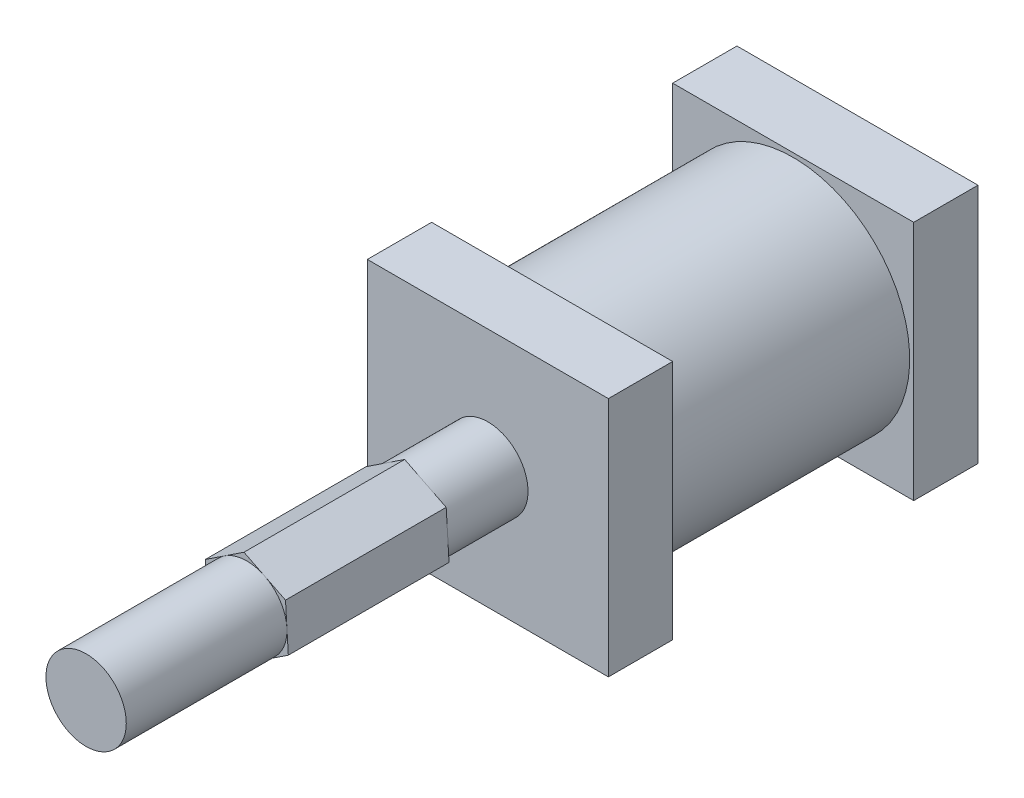
ISO-10303-21;
HEADER;
FILE_DESCRIPTION(('STEP AP214'),'2;1');
FILE_NAME('part.step','',(''),(''),'','','');
FILE_SCHEMA(('AUTOMOTIVE_DESIGN { 1 0 10303 214 1 1 1 1 }'));
ENDSEC;
DATA;
#1=APPLICATION_CONTEXT('core data for automotive mechanical design processes');
#2=APPLICATION_PROTOCOL_DEFINITION('international standard','automotive_design',2000,#1);
#3=PRODUCT_CONTEXT('',#1,'mechanical');
#4=PRODUCT('Part','Part','',(#3));
#5=PRODUCT_RELATED_PRODUCT_CATEGORY('part','',(#4));
#6=PRODUCT_DEFINITION_FORMATION('','',#4);
#7=PRODUCT_DEFINITION_CONTEXT('part definition',#1,'design');
#8=PRODUCT_DEFINITION('design','',#6,#7);
#9=PRODUCT_DEFINITION_SHAPE('','',#8);
#10=(LENGTH_UNIT() NAMED_UNIT(*) SI_UNIT(.MILLI.,.METRE.));
#11=(NAMED_UNIT(*) PLANE_ANGLE_UNIT() SI_UNIT($,.RADIAN.));
#12=(NAMED_UNIT(*) SI_UNIT($,.STERADIAN.) SOLID_ANGLE_UNIT());
#13=UNCERTAINTY_MEASURE_WITH_UNIT(LENGTH_MEASURE(1.E-05),#10,'distance_accuracy_value','');
#14=(GEOMETRIC_REPRESENTATION_CONTEXT(3) GLOBAL_UNCERTAINTY_ASSIGNED_CONTEXT((#13)) GLOBAL_UNIT_ASSIGNED_CONTEXT((#10,
#11,#12)) REPRESENTATION_CONTEXT('',''));
#15=CARTESIAN_POINT('',(0.,0.,0.));
#16=DIRECTION('',(0.,0.,1.));
#17=DIRECTION('',(1.,0.,0.));
#18=AXIS2_PLACEMENT_3D('',#15,#16,#17);
#19=CARTESIAN_POINT('',(0.,0.,96.52));
#20=DIRECTION('',(0.,0.,1.));
#21=DIRECTION('',(1.,0.,0.));
#22=AXIS2_PLACEMENT_3D('',#19,#20,#21);
#23=PLANE('',#22);
#24=CARTESIAN_POINT('',(19.05,19.05,96.52));
#25=DIRECTION('',(0.,0.,1.));
#26=DIRECTION('',(1.,0.,0.));
#27=AXIS2_PLACEMENT_3D('',#24,#25,#26);
#28=CIRCLE('',#27,6.35);
#29=CARTESIAN_POINT('',(25.3881327042533,19.4380384301526,96.52));
#30=VERTEX_POINT('',#29);
#31=CARTESIAN_POINT('',(21.8830152139698,24.7330031495166,96.52));
#32=VERTEX_POINT('',#31);
#33=EDGE_CURVE('E44',#30,#32,#28,.T.);
#34=ORIENTED_EDGE('',*,*,#33,.F.);
#35=DIRECTION('',(-0.0611084141972613,0.998131134528072,0.));
#36=VECTOR('',#35,1.);
#37=CARTESIAN_POINT('',(25.6121667963578,15.7787158071924,96.52));
#38=LINE('',#37,#36);
#39=CARTESIAN_POINT('',(25.1640986121487,23.0973610531128,96.52));
#40=VERTEX_POINT('',#39);
#41=EDGE_CURVE('E180',#30,#40,#38,.T.);
#42=ORIENTED_EDGE('',*,*,#41,.T.);
#43=DIRECTION('',(-0.894961125908124,0.446144128184226,0.));
#44=VECTOR('',#43,1.);
#45=CARTESIAN_POINT('',(25.1640986121487,23.0973610531128,96.52));
#46=LINE('',#45,#44);
#47=EDGE_CURVE('E193',#40,#32,#46,.T.);
#48=ORIENTED_EDGE('',*,*,#47,.T.);
#49=EDGE_LOOP('',(#34,#42,#48));
#50=FACE_BOUND('',#49,.T.);
#51=ADVANCED_FACE('F33',(#50),#23,.T.);
#52=CARTESIAN_POINT('',(15.5448825097166,24.344964719364,96.52));
#53=VERTEX_POINT('',#52);
#54=EDGE_CURVE('E11',#32,#53,#28,.T.);
#55=ORIENTED_EDGE('',*,*,#54,.F.);
#56=CARTESIAN_POINT('',(18.601931815791,26.3686452459204,96.52));
#57=VERTEX_POINT('',#56);
#58=EDGE_CURVE('E179',#32,#57,#46,.T.);
#59=ORIENTED_EDGE('',*,*,#58,.T.);
#60=DIRECTION('',(-0.833852711710863,-0.551987006343845,0.));
#61=VECTOR('',#60,1.);
#62=CARTESIAN_POINT('',(18.601931815791,26.3686452459204,96.52));
#63=LINE('',#62,#61);
#64=EDGE_CURVE('E205',#57,#53,#63,.T.);
#65=ORIENTED_EDGE('',*,*,#64,.T.);
#66=EDGE_LOOP('',(#55,#59,#65));
#67=FACE_BOUND('',#66,.T.);
#68=ADVANCED_FACE('F344',(#67),#23,.T.);
#69=CARTESIAN_POINT('',(12.7118672957468,18.6619615698474,96.52));
#70=VERTEX_POINT('',#69);
#71=EDGE_CURVE('E42',#53,#70,#28,.T.);
#72=ORIENTED_EDGE('',*,*,#71,.F.);
#73=CARTESIAN_POINT('',(12.4878332036422,22.3212841928076,96.52));
#74=VERTEX_POINT('',#73);
#75=EDGE_CURVE('E204',#53,#74,#63,.T.);
#76=ORIENTED_EDGE('',*,*,#75,.T.);
#77=DIRECTION('',(0.0611084141972611,-0.998131134528072,0.));
#78=VECTOR('',#77,1.);
#79=CARTESIAN_POINT('',(12.4878332036422,22.3212841928076,96.52));
#80=LINE('',#79,#78);
#81=EDGE_CURVE('E209',#74,#70,#80,.T.);
#82=ORIENTED_EDGE('',*,*,#81,.T.);
#83=EDGE_LOOP('',(#72,#76,#82));
#84=FACE_BOUND('',#83,.T.);
#85=ADVANCED_FACE('F349',(#84),#23,.T.);
#86=CARTESIAN_POINT('',(16.2169847860302,13.3669968504834,96.52));
#87=VERTEX_POINT('',#86);
#88=EDGE_CURVE('E198',#70,#87,#28,.T.);
#89=ORIENTED_EDGE('',*,*,#88,.F.);
#90=CARTESIAN_POINT('',(12.9359013878513,15.0026389468872,96.52));
#91=VERTEX_POINT('',#90);
#92=EDGE_CURVE('E208',#70,#91,#80,.T.);
#93=ORIENTED_EDGE('',*,*,#92,.T.);
#94=DIRECTION('',(0.894961125908124,-0.446144128184226,0.));
#95=VECTOR('',#94,1.);
#96=CARTESIAN_POINT('',(12.9359013878513,15.0026389468872,96.52));
#97=LINE('',#96,#95);
#98=EDGE_CURVE('E213',#91,#87,#97,.T.);
#99=ORIENTED_EDGE('',*,*,#98,.T.);
#100=EDGE_LOOP('',(#89,#93,#99));
#101=FACE_BOUND('',#100,.T.);
#102=ADVANCED_FACE('F365',(#101),#23,.T.);
#103=CARTESIAN_POINT('',(22.5551174902834,13.755035280636,96.52));
#104=VERTEX_POINT('',#103);
#105=EDGE_CURVE('E59',#87,#104,#28,.T.);
#106=ORIENTED_EDGE('',*,*,#105,.F.);
#107=CARTESIAN_POINT('',(19.4980681842091,11.7313547540796,96.52));
#108=VERTEX_POINT('',#107);
#109=EDGE_CURVE('E212',#87,#108,#97,.T.);
#110=ORIENTED_EDGE('',*,*,#109,.T.);
#111=DIRECTION('',(0.833852711710863,0.551987006343845,0.));
#112=VECTOR('',#111,1.);
#113=CARTESIAN_POINT('',(19.4980681842091,11.7313547540796,96.52));
#114=LINE('',#113,#112);
#115=EDGE_CURVE('E216',#108,#104,#114,.T.);
#116=ORIENTED_EDGE('',*,*,#115,.T.);
#117=EDGE_LOOP('',(#106,#110,#116));
#118=FACE_BOUND('',#117,.T.);
#119=ADVANCED_FACE('F338',(#118),#23,.T.);
#120=CARTESIAN_POINT('',(0.,0.,58.42));
#121=DIRECTION('',(0.,0.,-1.));
#122=DIRECTION('',(-1.,0.,0.));
#123=AXIS2_PLACEMENT_3D('',#120,#121,#122);
#124=PLANE('',#123);
#125=DIRECTION('',(0.,-1.,0.));
#126=VECTOR('',#125,1.);
#127=CARTESIAN_POINT('',(0.,0.,58.42));
#128=LINE('',#127,#126);
#129=CARTESIAN_POINT('',(0.,38.1,58.42));
#130=VERTEX_POINT('',#129);
#131=CARTESIAN_POINT('',(0.,0.,58.42));
#132=VERTEX_POINT('',#131);
#133=EDGE_CURVE('E261',#130,#132,#128,.T.);
#134=ORIENTED_EDGE('',*,*,#133,.T.);
#135=DIRECTION('',(1.,0.,0.));
#136=VECTOR('',#135,1.);
#137=CARTESIAN_POINT('',(0.,0.,58.42));
#138=LINE('',#137,#136);
#139=CARTESIAN_POINT('',(38.1,0.,58.42));
#140=VERTEX_POINT('',#139);
#141=EDGE_CURVE('E264',#132,#140,#138,.T.);
#142=ORIENTED_EDGE('',*,*,#141,.T.);
#143=DIRECTION('',(0.,1.,0.));
#144=VECTOR('',#143,1.);
#145=CARTESIAN_POINT('',(38.1,0.,58.42));
#146=LINE('',#145,#144);
#147=CARTESIAN_POINT('',(38.1,38.1,58.42));
#148=VERTEX_POINT('',#147);
#149=EDGE_CURVE('E267',#140,#148,#146,.T.);
#150=ORIENTED_EDGE('',*,*,#149,.T.);
#151=DIRECTION('',(-1.,0.,0.));
#152=VECTOR('',#151,1.);
#153=CARTESIAN_POINT('',(0.,38.1,58.42));
#154=LINE('',#153,#152);
#155=EDGE_CURVE('E269',#148,#130,#154,.T.);
#156=ORIENTED_EDGE('',*,*,#155,.T.);
#157=EDGE_LOOP('',(#134,#142,#150,#156));
#158=FACE_BOUND('',#157,.T.);
#159=CARTESIAN_POINT('',(19.05,19.05,58.42));
#160=DIRECTION('',(0.,0.,-1.));
#161=DIRECTION('',(-1.,0.,0.));
#162=AXIS2_PLACEMENT_3D('',#159,#160,#161);
#163=CIRCLE('',#162,6.35);
#164=CARTESIAN_POINT('',(12.7,19.05,58.42));
#165=VERTEX_POINT('',#164);
#166=EDGE_CURVE('E37',#165,#165,#163,.F.);
#167=ORIENTED_EDGE('',*,*,#166,.F.);
#168=EDGE_LOOP('',(#167));
#169=FACE_BOUND('',#168,.T.);
#170=ADVANCED_FACE('F329',(#158,#169),#124,.F.);
#171=CARTESIAN_POINT('',(0.,0.,10.16));
#172=DIRECTION('',(0.,0.,-1.));
#173=DIRECTION('',(-1.,0.,0.));
#174=AXIS2_PLACEMENT_3D('',#171,#172,#173);
#175=PLANE('',#174);
#176=DIRECTION('',(0.,-1.,0.));
#177=VECTOR('',#176,1.);
#178=CARTESIAN_POINT('',(0.,0.,10.16));
#179=LINE('',#178,#177);
#180=CARTESIAN_POINT('',(0.,38.1,10.16));
#181=VERTEX_POINT('',#180);
#182=CARTESIAN_POINT('',(0.,0.,10.16));
#183=VERTEX_POINT('',#182);
#184=EDGE_CURVE('E294',#181,#183,#179,.T.);
#185=ORIENTED_EDGE('',*,*,#184,.T.);
#186=DIRECTION('',(1.,0.,0.));
#187=VECTOR('',#186,1.);
#188=CARTESIAN_POINT('',(0.,0.,10.16));
#189=LINE('',#188,#187);
#190=CARTESIAN_POINT('',(38.1,0.,10.16));
#191=VERTEX_POINT('',#190);
#192=EDGE_CURVE('E297',#183,#191,#189,.T.);
#193=ORIENTED_EDGE('',*,*,#192,.T.);
#194=DIRECTION('',(0.,1.,0.));
#195=VECTOR('',#194,1.);
#196=CARTESIAN_POINT('',(38.1,0.,10.16));
#197=LINE('',#196,#195);
#198=CARTESIAN_POINT('',(38.1,38.1,10.16));
#199=VERTEX_POINT('',#198);
#200=EDGE_CURVE('E300',#191,#199,#197,.T.);
#201=ORIENTED_EDGE('',*,*,#200,.T.);
#202=DIRECTION('',(-1.,0.,0.));
#203=VECTOR('',#202,1.);
#204=CARTESIAN_POINT('',(0.,38.1,10.16));
#205=LINE('',#204,#203);
#206=EDGE_CURVE('E302',#199,#181,#205,.T.);
#207=ORIENTED_EDGE('',*,*,#206,.T.);
#208=EDGE_LOOP('',(#185,#193,#201,#207));
#209=FACE_BOUND('',#208,.T.);
#210=CARTESIAN_POINT('',(19.05,19.05,10.16));
#211=DIRECTION('',(0.,0.,-1.));
#212=DIRECTION('',(-1.,0.,0.));
#213=AXIS2_PLACEMENT_3D('',#210,#211,#212);
#214=CIRCLE('',#213,18.415);
#215=CARTESIAN_POINT('',(0.635000000000007,19.05,10.16));
#216=VERTEX_POINT('',#215);
#217=EDGE_CURVE('E200',#216,#216,#214,.F.);
#218=ORIENTED_EDGE('',*,*,#217,.F.);
#219=EDGE_LOOP('',(#218));
#220=FACE_BOUND('',#219,.T.);
#221=ADVANCED_FACE('F327',(#209,#220),#175,.F.);
#222=CARTESIAN_POINT('',(0.,0.,10.16));
#223=DIRECTION('',(1.,0.,0.));
#224=DIRECTION('',(0.,0.,-1.));
#225=AXIS2_PLACEMENT_3D('',#222,#223,#224);
#226=PLANE('',#225);
#227=DIRECTION('',(0.,-1.,0.));
#228=VECTOR('',#227,1.);
#229=CARTESIAN_POINT('',(0.,0.,0.));
#230=LINE('',#229,#228);
#231=CARTESIAN_POINT('',(0.,38.1,0.));
#232=VERTEX_POINT('',#231);
#233=CARTESIAN_POINT('',(0.,0.,0.));
#234=VERTEX_POINT('',#233);
#235=EDGE_CURVE('E293',#232,#234,#230,.T.);
#236=ORIENTED_EDGE('',*,*,#235,.T.);
#237=DIRECTION('',(0.,0.,-1.));
#238=VECTOR('',#237,1.);
#239=CARTESIAN_POINT('',(0.,0.,10.16));
#240=LINE('',#239,#238);
#241=EDGE_CURVE('E320',#183,#234,#240,.T.);
#242=ORIENTED_EDGE('',*,*,#241,.F.);
#243=ORIENTED_EDGE('',*,*,#184,.F.);
#244=DIRECTION('',(0.,0.,-1.));
#245=VECTOR('',#244,1.);
#246=CARTESIAN_POINT('',(0.,38.1,10.16));
#247=LINE('',#246,#245);
#248=EDGE_CURVE('E304',#181,#232,#247,.T.);
#249=ORIENTED_EDGE('',*,*,#248,.T.);
#250=EDGE_LOOP('',(#236,#242,#243,#249));
#251=FACE_BOUND('',#250,.T.);
#252=ADVANCED_FACE('F35',(#251),#226,.F.);
#253=CARTESIAN_POINT('',(0.,0.,10.16));
#254=DIRECTION('',(0.,1.,0.));
#255=DIRECTION('',(0.,0.,1.));
#256=AXIS2_PLACEMENT_3D('',#253,#254,#255);
#257=PLANE('',#256);
#258=DIRECTION('',(1.,0.,0.));
#259=VECTOR('',#258,1.);
#260=CARTESIAN_POINT('',(0.,0.,0.));
#261=LINE('',#260,#259);
#262=CARTESIAN_POINT('',(38.1,0.,0.));
#263=VERTEX_POINT('',#262);
#264=EDGE_CURVE('E307',#234,#263,#261,.T.);
#265=ORIENTED_EDGE('',*,*,#264,.T.);
#266=DIRECTION('',(0.,0.,-1.));
#267=VECTOR('',#266,1.);
#268=CARTESIAN_POINT('',(38.1,0.,10.16));
#269=LINE('',#268,#267);
#270=EDGE_CURVE('E317',#191,#263,#269,.T.);
#271=ORIENTED_EDGE('',*,*,#270,.F.);
#272=ORIENTED_EDGE('',*,*,#192,.F.);
#273=ORIENTED_EDGE('',*,*,#241,.T.);
#274=EDGE_LOOP('',(#265,#271,#272,#273));
#275=FACE_BOUND('',#274,.T.);
#276=ADVANCED_FACE('F336',(#275),#257,.F.);
#277=CARTESIAN_POINT('',(38.1,0.,10.16));
#278=DIRECTION('',(-1.,0.,0.));
#279=DIRECTION('',(0.,0.,1.));
#280=AXIS2_PLACEMENT_3D('',#277,#278,#279);
#281=PLANE('',#280);
#282=DIRECTION('',(0.,1.,0.));
#283=VECTOR('',#282,1.);
#284=CARTESIAN_POINT('',(38.1,0.,0.));
#285=LINE('',#284,#283);
#286=CARTESIAN_POINT('',(38.1,38.1,0.));
#287=VERTEX_POINT('',#286);
#288=EDGE_CURVE('E309',#263,#287,#285,.T.);
#289=ORIENTED_EDGE('',*,*,#288,.T.);
#290=DIRECTION('',(0.,0.,-1.));
#291=VECTOR('',#290,1.);
#292=CARTESIAN_POINT('',(38.1,38.1,10.16));
#293=LINE('',#292,#291);
#294=EDGE_CURVE('E314',#199,#287,#293,.T.);
#295=ORIENTED_EDGE('',*,*,#294,.F.);
#296=ORIENTED_EDGE('',*,*,#200,.F.);
#297=ORIENTED_EDGE('',*,*,#270,.T.);
#298=EDGE_LOOP('',(#289,#295,#296,#297));
#299=FACE_BOUND('',#298,.T.);
#300=ADVANCED_FACE('F649',(#299),#281,.F.);
#301=CARTESIAN_POINT('',(0.,38.1,10.16));
#302=DIRECTION('',(0.,-1.,0.));
#303=DIRECTION('',(0.,0.,-1.));
#304=AXIS2_PLACEMENT_3D('',#301,#302,#303);
#305=PLANE('',#304);
#306=DIRECTION('',(-1.,0.,0.));
#307=VECTOR('',#306,1.);
#308=CARTESIAN_POINT('',(0.,38.1,0.));
#309=LINE('',#308,#307);
#310=EDGE_CURVE('E298',#287,#232,#309,.T.);
#311=ORIENTED_EDGE('',*,*,#310,.T.);
#312=ORIENTED_EDGE('',*,*,#248,.F.);
#313=ORIENTED_EDGE('',*,*,#206,.F.);
#314=ORIENTED_EDGE('',*,*,#294,.T.);
#315=EDGE_LOOP('',(#311,#312,#313,#314));
#316=FACE_BOUND('',#315,.T.);
#317=ADVANCED_FACE('F640',(#316),#305,.F.);
#318=CARTESIAN_POINT('',(0.,0.,0.));
#319=DIRECTION('',(0.,0.,-1.));
#320=DIRECTION('',(-1.,0.,0.));
#321=AXIS2_PLACEMENT_3D('',#318,#319,#320);
#322=PLANE('',#321);
#323=ORIENTED_EDGE('',*,*,#235,.F.);
#324=ORIENTED_EDGE('',*,*,#310,.F.);
#325=ORIENTED_EDGE('',*,*,#288,.F.);
#326=ORIENTED_EDGE('',*,*,#264,.F.);
#327=EDGE_LOOP('',(#323,#324,#325,#326));
#328=FACE_BOUND('',#327,.T.);
#329=ADVANCED_FACE('F626',(#328),#322,.T.);
#330=CARTESIAN_POINT('',(19.05,19.05,48.26));
#331=DIRECTION('',(0.,0.,-1.));
#332=DIRECTION('',(-1.,0.,0.));
#333=AXIS2_PLACEMENT_3D('',#330,#331,#332);
#334=CYLINDRICAL_SURFACE('',#333,18.415);
#335=CARTESIAN_POINT('',(19.05,19.05,48.26));
#336=DIRECTION('',(0.,0.,1.));
#337=DIRECTION('',(1.,0.,0.));
#338=AXIS2_PLACEMENT_3D('',#335,#336,#337);
#339=CIRCLE('',#338,18.415);
#340=CARTESIAN_POINT('',(0.635000000000007,19.05,48.26));
#341=VERTEX_POINT('',#340);
#342=EDGE_CURVE('E290',#341,#341,#339,.T.);
#343=CARTESIAN_POINT('',(0.635000000000007,19.05,48.26));
#344=CARTESIAN_POINT('',(0.635000000000007,19.05,47.863125));
#345=CARTESIAN_POINT('',(0.635000000000007,19.05,47.46625));
#346=CARTESIAN_POINT('',(0.635000000000007,19.05,46.6725));
#347=CARTESIAN_POINT('',(0.635000000000007,19.05,46.275625));
#348=CARTESIAN_POINT('',(0.635000000000007,19.05,45.481875));
#349=CARTESIAN_POINT('',(0.635000000000007,19.05,45.085));
#350=CARTESIAN_POINT('',(0.635000000000007,19.05,44.29125));
#351=CARTESIAN_POINT('',(0.635000000000007,19.05,43.894375));
#352=CARTESIAN_POINT('',(0.635000000000007,19.05,43.100625));
#353=CARTESIAN_POINT('',(0.635000000000007,19.05,42.70375));
#354=CARTESIAN_POINT('',(0.635000000000007,19.05,41.91));
#355=CARTESIAN_POINT('',(0.635000000000007,19.05,41.513125));
#356=CARTESIAN_POINT('',(0.635000000000007,19.05,40.719375));
#357=CARTESIAN_POINT('',(0.635000000000007,19.05,40.3225));
#358=CARTESIAN_POINT('',(0.635000000000007,19.05,39.52875));
#359=CARTESIAN_POINT('',(0.635000000000007,19.05,39.131875));
#360=CARTESIAN_POINT('',(0.635000000000007,19.05,38.338125));
#361=CARTESIAN_POINT('',(0.635000000000007,19.05,37.94125));
#362=CARTESIAN_POINT('',(0.635000000000007,19.05,37.1475));
#363=CARTESIAN_POINT('',(0.635000000000007,19.05,36.750625));
#364=CARTESIAN_POINT('',(0.635000000000007,19.05,35.956875));
#365=CARTESIAN_POINT('',(0.635000000000007,19.05,35.56));
#366=CARTESIAN_POINT('',(0.635000000000007,19.05,34.76625));
#367=CARTESIAN_POINT('',(0.635000000000007,19.05,34.369375));
#368=CARTESIAN_POINT('',(0.635000000000007,19.05,33.575625));
#369=CARTESIAN_POINT('',(0.635000000000007,19.05,33.17875));
#370=CARTESIAN_POINT('',(0.635000000000007,19.05,32.385));
#371=CARTESIAN_POINT('',(0.635000000000007,19.05,31.988125));
#372=CARTESIAN_POINT('',(0.635000000000007,19.05,31.194375));
#373=CARTESIAN_POINT('',(0.635000000000007,19.05,30.7975));
#374=CARTESIAN_POINT('',(0.635000000000007,19.05,30.00375));
#375=CARTESIAN_POINT('',(0.635000000000007,19.05,29.606875));
#376=CARTESIAN_POINT('',(0.635000000000007,19.05,28.813125));
#377=CARTESIAN_POINT('',(0.635000000000007,19.05,28.41625));
#378=CARTESIAN_POINT('',(0.635000000000007,19.05,27.6225));
#379=CARTESIAN_POINT('',(0.635000000000007,19.05,27.225625));
#380=CARTESIAN_POINT('',(0.635000000000007,19.05,26.431875));
#381=CARTESIAN_POINT('',(0.635000000000007,19.05,26.035));
#382=CARTESIAN_POINT('',(0.635000000000007,19.05,25.24125));
#383=CARTESIAN_POINT('',(0.635000000000007,19.05,24.844375));
#384=CARTESIAN_POINT('',(0.635000000000007,19.05,24.050625));
#385=CARTESIAN_POINT('',(0.635000000000007,19.05,23.65375));
#386=CARTESIAN_POINT('',(0.635000000000007,19.05,22.86));
#387=CARTESIAN_POINT('',(0.635000000000007,19.05,22.463125));
#388=CARTESIAN_POINT('',(0.635000000000007,19.05,21.669375));
#389=CARTESIAN_POINT('',(0.635000000000007,19.05,21.2725));
#390=CARTESIAN_POINT('',(0.635000000000007,19.05,20.47875));
#391=CARTESIAN_POINT('',(0.635000000000007,19.05,20.081875));
#392=CARTESIAN_POINT('',(0.635000000000007,19.05,19.288125));
#393=CARTESIAN_POINT('',(0.635000000000007,19.05,18.89125));
#394=CARTESIAN_POINT('',(0.635000000000007,19.05,18.0975));
#395=CARTESIAN_POINT('',(0.635000000000007,19.05,17.700625));
#396=CARTESIAN_POINT('',(0.635000000000007,19.05,16.906875));
#397=CARTESIAN_POINT('',(0.635000000000007,19.05,16.51));
#398=CARTESIAN_POINT('',(0.635000000000007,19.05,15.71625));
#399=CARTESIAN_POINT('',(0.635000000000007,19.05,15.319375));
#400=CARTESIAN_POINT('',(0.635000000000007,19.05,14.525625));
#401=CARTESIAN_POINT('',(0.635000000000007,19.05,14.12875));
#402=CARTESIAN_POINT('',(0.635000000000007,19.05,13.335));
#403=CARTESIAN_POINT('',(0.635000000000007,19.05,12.938125));
#404=CARTESIAN_POINT('',(0.635000000000007,19.05,12.144375));
#405=CARTESIAN_POINT('',(0.635000000000007,19.05,11.7475));
#406=CARTESIAN_POINT('',(0.635000000000007,19.05,10.95375));
#407=CARTESIAN_POINT('',(0.635000000000007,19.05,10.556875));
#408=CARTESIAN_POINT('',(0.635000000000007,19.05,10.16));
#409=B_SPLINE_CURVE_WITH_KNOTS('',3,(#343,#344,#345,#346,#347,#348,#349,#350,#351,#352,#353,
#354,#355,#356,#357,#358,#359,#360,#361,#362,#363,#364,#365,#366,#367,#368,#369,#370,#371,#372,
#373,#374,#375,#376,#377,#378,#379,#380,#381,#382,#383,#384,#385,#386,#387,#388,#389,#390,#391,
#392,#393,#394,#395,#396,#397,#398,#399,#400,#401,#402,#403,#404,#405,#406,#407,#408),
.UNSPECIFIED.,.F.,.F.,(4,2,2,2,2,2,2,2,2,2,2,2,2,2,2,2,2,2,2,2,2,2,2,2,2,2,2,2,2,2,2,2,4),(0.,
1.19062499999999,2.38124999999999,3.571875,4.7625,5.953125,7.14375,8.33437499999999,
9.52499999999999,10.715625,11.90625,13.096875,14.2875,15.478125,16.66875,17.859375,19.05,
20.240625,21.43125,22.621875,23.8125,25.003125,26.19375,27.384375,28.575,29.765625,30.95625,
32.146875,33.3375,34.528125,35.71875,36.909375,38.1),.UNSPECIFIED.);
#410=EDGE_CURVE('BSEAM325',#341,#216,#409,.T.);
#411=ORIENTED_EDGE('',*,*,#342,.F.);
#412=ORIENTED_EDGE('',*,*,#217,.T.);
#413=ORIENTED_EDGE('',*,*,#410,.T.);
#414=ORIENTED_EDGE('',*,*,#410,.F.);
#415=EDGE_LOOP('',(#411,#413,#412,#414));
#416=FACE_BOUND('',#415,.T.);
#417=ADVANCED_FACE('F325',(#416),#334,.T.);
#418=CARTESIAN_POINT('',(0.,0.,48.26));
#419=DIRECTION('',(0.,0.,-1.));
#420=DIRECTION('',(-1.,0.,0.));
#421=AXIS2_PLACEMENT_3D('',#418,#419,#420);
#422=PLANE('',#421);
#423=DIRECTION('',(0.,-1.,0.));
#424=VECTOR('',#423,1.);
#425=CARTESIAN_POINT('',(0.,0.,48.26));
#426=LINE('',#425,#424);
#427=CARTESIAN_POINT('',(0.,38.1,48.26));
#428=VERTEX_POINT('',#427);
#429=CARTESIAN_POINT('',(0.,0.,48.26));
#430=VERTEX_POINT('',#429);
#431=EDGE_CURVE('E259',#428,#430,#426,.T.);
#432=ORIENTED_EDGE('',*,*,#431,.F.);
#433=DIRECTION('',(-1.,0.,0.));
#434=VECTOR('',#433,1.);
#435=CARTESIAN_POINT('',(0.,38.1,48.26));
#436=LINE('',#435,#434);
#437=CARTESIAN_POINT('',(38.1,38.1,48.26));
#438=VERTEX_POINT('',#437);
#439=EDGE_CURVE('E265',#438,#428,#436,.T.);
#440=ORIENTED_EDGE('',*,*,#439,.F.);
#441=DIRECTION('',(0.,1.,0.));
#442=VECTOR('',#441,1.);
#443=CARTESIAN_POINT('',(38.1,0.,48.26));
#444=LINE('',#443,#442);
#445=CARTESIAN_POINT('',(38.1,0.,48.26));
#446=VERTEX_POINT('',#445);
#447=EDGE_CURVE('E276',#446,#438,#444,.T.);
#448=ORIENTED_EDGE('',*,*,#447,.F.);
#449=DIRECTION('',(1.,0.,0.));
#450=VECTOR('',#449,1.);
#451=CARTESIAN_POINT('',(0.,0.,48.26));
#452=LINE('',#451,#450);
#453=EDGE_CURVE('E274',#430,#446,#452,.T.);
#454=ORIENTED_EDGE('',*,*,#453,.F.);
#455=EDGE_LOOP('',(#432,#440,#448,#454));
#456=FACE_BOUND('',#455,.T.);
#457=ORIENTED_EDGE('',*,*,#342,.T.);
#458=EDGE_LOOP('',(#457));
#459=FACE_BOUND('',#458,.T.);
#460=ADVANCED_FACE('F608',(#456,#459),#422,.T.);
#461=CARTESIAN_POINT('',(0.,0.,58.42));
#462=DIRECTION('',(1.,0.,0.));
#463=DIRECTION('',(0.,0.,-1.));
#464=AXIS2_PLACEMENT_3D('',#461,#462,#463);
#465=PLANE('',#464);
#466=ORIENTED_EDGE('',*,*,#431,.T.);
#467=DIRECTION('',(0.,0.,-1.));
#468=VECTOR('',#467,1.);
#469=CARTESIAN_POINT('',(0.,0.,58.42));
#470=LINE('',#469,#468);
#471=EDGE_CURVE('E287',#132,#430,#470,.T.);
#472=ORIENTED_EDGE('',*,*,#471,.F.);
#473=ORIENTED_EDGE('',*,*,#133,.F.);
#474=DIRECTION('',(0.,0.,-1.));
#475=VECTOR('',#474,1.);
#476=CARTESIAN_POINT('',(0.,38.1,58.42));
#477=LINE('',#476,#475);
#478=EDGE_CURVE('E271',#130,#428,#477,.T.);
#479=ORIENTED_EDGE('',*,*,#478,.T.);
#480=EDGE_LOOP('',(#466,#472,#473,#479));
#481=FACE_BOUND('',#480,.T.);
#482=ADVANCED_FACE('F598',(#481),#465,.F.);
#483=CARTESIAN_POINT('',(0.,0.,58.42));
#484=DIRECTION('',(0.,1.,0.));
#485=DIRECTION('',(0.,0.,1.));
#486=AXIS2_PLACEMENT_3D('',#483,#484,#485);
#487=PLANE('',#486);
#488=ORIENTED_EDGE('',*,*,#453,.T.);
#489=DIRECTION('',(0.,0.,-1.));
#490=VECTOR('',#489,1.);
#491=CARTESIAN_POINT('',(38.1,0.,58.42));
#492=LINE('',#491,#490);
#493=EDGE_CURVE('E284',#140,#446,#492,.T.);
#494=ORIENTED_EDGE('',*,*,#493,.F.);
#495=ORIENTED_EDGE('',*,*,#141,.F.);
#496=ORIENTED_EDGE('',*,*,#471,.T.);
#497=EDGE_LOOP('',(#488,#494,#495,#496));
#498=FACE_BOUND('',#497,.T.);
#499=ADVANCED_FACE('F588',(#498),#487,.F.);
#500=CARTESIAN_POINT('',(38.1,0.,58.42));
#501=DIRECTION('',(-1.,0.,0.));
#502=DIRECTION('',(0.,0.,1.));
#503=AXIS2_PLACEMENT_3D('',#500,#501,#502);
#504=PLANE('',#503);
#505=ORIENTED_EDGE('',*,*,#447,.T.);
#506=DIRECTION('',(0.,0.,-1.));
#507=VECTOR('',#506,1.);
#508=CARTESIAN_POINT('',(38.1,38.1,58.42));
#509=LINE('',#508,#507);
#510=EDGE_CURVE('E281',#148,#438,#509,.T.);
#511=ORIENTED_EDGE('',*,*,#510,.F.);
#512=ORIENTED_EDGE('',*,*,#149,.F.);
#513=ORIENTED_EDGE('',*,*,#493,.T.);
#514=EDGE_LOOP('',(#505,#511,#512,#513));
#515=FACE_BOUND('',#514,.T.);
#516=ADVANCED_FACE('F578',(#515),#504,.F.);
#517=CARTESIAN_POINT('',(0.,38.1,58.42));
#518=DIRECTION('',(0.,-1.,0.));
#519=DIRECTION('',(0.,0.,-1.));
#520=AXIS2_PLACEMENT_3D('',#517,#518,#519);
#521=PLANE('',#520);
#522=ORIENTED_EDGE('',*,*,#439,.T.);
#523=ORIENTED_EDGE('',*,*,#478,.F.);
#524=ORIENTED_EDGE('',*,*,#155,.F.);
#525=ORIENTED_EDGE('',*,*,#510,.T.);
#526=EDGE_LOOP('',(#522,#523,#524,#525));
#527=FACE_BOUND('',#526,.T.);
#528=ADVANCED_FACE('F563',(#527),#521,.F.);
#529=CARTESIAN_POINT('',(19.05,19.05,71.12));
#530=DIRECTION('',(0.,0.,-1.));
#531=DIRECTION('',(-1.,0.,0.));
#532=AXIS2_PLACEMENT_3D('',#529,#530,#531);
#533=CYLINDRICAL_SURFACE('',#532,6.35);
#534=CARTESIAN_POINT('',(19.05,19.05,71.12));
#535=DIRECTION('',(0.,0.,1.));
#536=DIRECTION('',(1.,0.,0.));
#537=AXIS2_PLACEMENT_3D('',#534,#535,#536);
#538=CIRCLE('',#537,6.35);
#539=CARTESIAN_POINT('',(25.3881327042532,19.4380384301526,71.12));
#540=VERTEX_POINT('',#539);
#541=CARTESIAN_POINT('',(21.8830152139698,24.7330031495166,71.12));
#542=VERTEX_POINT('',#541);
#543=EDGE_CURVE('E256',#540,#542,#538,.T.);
#544=ORIENTED_EDGE('',*,*,#543,.F.);
#545=CARTESIAN_POINT('',(22.5551174902834,13.755035280636,71.12));
#546=VERTEX_POINT('',#545);
#547=EDGE_CURVE('E255',#546,#540,#538,.T.);
#548=ORIENTED_EDGE('',*,*,#547,.F.);
#549=CARTESIAN_POINT('',(16.2169847860302,13.3669968504834,71.12));
#550=VERTEX_POINT('',#549);
#551=EDGE_CURVE('E418',#550,#546,#538,.T.);
#552=ORIENTED_EDGE('',*,*,#551,.F.);
#553=CARTESIAN_POINT('',(12.7118672957468,18.6619615698474,71.12));
#554=VERTEX_POINT('',#553);
#555=EDGE_CURVE('E401',#554,#550,#538,.T.);
#556=ORIENTED_EDGE('',*,*,#555,.F.);
#557=CARTESIAN_POINT('',(15.5448825097166,24.344964719364,71.12));
#558=VERTEX_POINT('',#557);
#559=EDGE_CURVE('E397',#558,#554,#538,.T.);
#560=ORIENTED_EDGE('',*,*,#559,.F.);
#561=EDGE_CURVE('E260',#542,#558,#538,.T.);
#562=ORIENTED_EDGE('',*,*,#561,.F.);
#563=EDGE_LOOP('',(#544,#548,#552,#556,#560,#562));
#564=FACE_BOUND('',#563,.T.);
#565=ORIENTED_EDGE('',*,*,#166,.T.);
#566=EDGE_LOOP('',(#565));
#567=FACE_BOUND('',#566,.T.);
#568=ADVANCED_FACE('F555',(#564,#567),#533,.T.);
#569=CARTESIAN_POINT('',(0.,0.,71.12));
#570=DIRECTION('',(0.,0.,1.));
#571=DIRECTION('',(1.,0.,0.));
#572=AXIS2_PLACEMENT_3D('',#569,#570,#571);
#573=PLANE('',#572);
#574=DIRECTION('',(-0.0611084141972613,0.998131134528072,0.));
#575=VECTOR('',#574,1.);
#576=CARTESIAN_POINT('',(25.6121667963578,15.7787158071924,71.12));
#577=LINE('',#576,#575);
#578=CARTESIAN_POINT('',(25.1640986121487,23.0973610531128,71.12));
#579=VERTEX_POINT('',#578);
#580=EDGE_CURVE('E222',#540,#579,#577,.T.);
#581=ORIENTED_EDGE('',*,*,#580,.F.);
#582=ORIENTED_EDGE('',*,*,#543,.T.);
#583=DIRECTION('',(-0.894961125908124,0.446144128184226,0.));
#584=VECTOR('',#583,1.);
#585=CARTESIAN_POINT('',(25.1640986121487,23.0973610531128,71.12));
#586=LINE('',#585,#584);
#587=EDGE_CURVE('E223',#579,#542,#586,.T.);
#588=ORIENTED_EDGE('',*,*,#587,.F.);
#589=EDGE_LOOP('',(#581,#582,#588));
#590=FACE_BOUND('',#589,.T.);
#591=ADVANCED_FACE('F421',(#590),#573,.F.);
#592=CARTESIAN_POINT('',(18.601931815791,26.3686452459204,71.12));
#593=VERTEX_POINT('',#592);
#594=EDGE_CURVE('E221',#542,#593,#586,.T.);
#595=ORIENTED_EDGE('',*,*,#594,.F.);
#596=ORIENTED_EDGE('',*,*,#561,.T.);
#597=DIRECTION('',(-0.833852711710863,-0.551987006343845,0.));
#598=VECTOR('',#597,1.);
#599=CARTESIAN_POINT('',(18.601931815791,26.3686452459204,71.12));
#600=LINE('',#599,#598);
#601=EDGE_CURVE('E227',#593,#558,#600,.T.);
#602=ORIENTED_EDGE('',*,*,#601,.F.);
#603=EDGE_LOOP('',(#595,#596,#602));
#604=FACE_BOUND('',#603,.T.);
#605=ADVANCED_FACE('F539',(#604),#573,.F.);
#606=CARTESIAN_POINT('',(12.4878332036422,22.3212841928076,71.12));
#607=VERTEX_POINT('',#606);
#608=EDGE_CURVE('E226',#558,#607,#600,.T.);
#609=ORIENTED_EDGE('',*,*,#608,.F.);
#610=ORIENTED_EDGE('',*,*,#559,.T.);
#611=DIRECTION('',(0.0611084141972611,-0.998131134528072,0.));
#612=VECTOR('',#611,1.);
#613=CARTESIAN_POINT('',(12.4878332036422,22.3212841928076,71.12));
#614=LINE('',#613,#612);
#615=EDGE_CURVE('E231',#607,#554,#614,.T.);
#616=ORIENTED_EDGE('',*,*,#615,.F.);
#617=EDGE_LOOP('',(#609,#610,#616));
#618=FACE_BOUND('',#617,.T.);
#619=ADVANCED_FACE('F396',(#618),#573,.F.);
#620=CARTESIAN_POINT('',(12.9359013878513,15.0026389468872,71.12));
#621=VERTEX_POINT('',#620);
#622=EDGE_CURVE('E230',#554,#621,#614,.T.);
#623=ORIENTED_EDGE('',*,*,#622,.F.);
#624=ORIENTED_EDGE('',*,*,#555,.T.);
#625=DIRECTION('',(0.894961125908124,-0.446144128184226,0.));
#626=VECTOR('',#625,1.);
#627=CARTESIAN_POINT('',(12.9359013878513,15.0026389468872,71.12));
#628=LINE('',#627,#626);
#629=EDGE_CURVE('E235',#621,#550,#628,.T.);
#630=ORIENTED_EDGE('',*,*,#629,.F.);
#631=EDGE_LOOP('',(#623,#624,#630));
#632=FACE_BOUND('',#631,.T.);
#633=ADVANCED_FACE('F405',(#632),#573,.F.);
#634=CARTESIAN_POINT('',(19.4980681842091,11.7313547540796,71.12));
#635=VERTEX_POINT('',#634);
#636=EDGE_CURVE('E234',#550,#635,#628,.T.);
#637=ORIENTED_EDGE('',*,*,#636,.F.);
#638=ORIENTED_EDGE('',*,*,#551,.T.);
#639=DIRECTION('',(0.833852711710863,0.551987006343845,0.));
#640=VECTOR('',#639,1.);
#641=CARTESIAN_POINT('',(19.4980681842091,11.7313547540796,71.12));
#642=LINE('',#641,#640);
#643=EDGE_CURVE('E191',#635,#546,#642,.T.);
#644=ORIENTED_EDGE('',*,*,#643,.F.);
#645=EDGE_LOOP('',(#637,#638,#644));
#646=FACE_BOUND('',#645,.T.);
#647=ADVANCED_FACE('F516',(#646),#573,.F.);
#648=CARTESIAN_POINT('',(25.6121667963578,15.7787158071924,71.12));
#649=VERTEX_POINT('',#648);
#650=EDGE_CURVE('E238',#546,#649,#642,.T.);
#651=ORIENTED_EDGE('',*,*,#650,.F.);
#652=ORIENTED_EDGE('',*,*,#547,.T.);
#653=EDGE_CURVE('E219',#649,#540,#577,.T.);
#654=ORIENTED_EDGE('',*,*,#653,.F.);
#655=EDGE_LOOP('',(#651,#652,#654));
#656=FACE_BOUND('',#655,.T.);
#657=ADVANCED_FACE('F415',(#656),#573,.F.);
#658=CARTESIAN_POINT('',(25.6121667963578,15.7787158071924,96.52));
#659=DIRECTION('',(-0.998131134528072,-0.0611084141972613,0.));
#660=DIRECTION('',(0.0611084141972613,-0.998131134528072,0.));
#661=AXIS2_PLACEMENT_3D('',#658,#659,#660);
#662=PLANE('',#661);
#663=ORIENTED_EDGE('',*,*,#653,.T.);
#664=ORIENTED_EDGE('',*,*,#580,.T.);
#665=DIRECTION('',(0.,0.,-1.));
#666=VECTOR('',#665,1.);
#667=CARTESIAN_POINT('',(25.1640986121487,23.0973610531128,96.52));
#668=LINE('',#667,#666);
#669=EDGE_CURVE('E187',#40,#579,#668,.T.);
#670=ORIENTED_EDGE('',*,*,#669,.F.);
#671=ORIENTED_EDGE('',*,*,#41,.F.);
#672=CARTESIAN_POINT('',(25.6121667963578,15.7787158071924,96.52));
#673=VERTEX_POINT('',#672);
#674=EDGE_CURVE('E172',#673,#30,#38,.T.);
#675=ORIENTED_EDGE('',*,*,#674,.F.);
#676=DIRECTION('',(0.,0.,-1.));
#677=VECTOR('',#676,1.);
#678=CARTESIAN_POINT('',(25.6121667963578,15.7787158071924,96.52));
#679=LINE('',#678,#677);
#680=EDGE_CURVE('E218',#673,#649,#679,.T.);
#681=ORIENTED_EDGE('',*,*,#680,.T.);
#682=EDGE_LOOP('',(#663,#664,#670,#671,#675,#681));
#683=FACE_BOUND('',#682,.T.);
#684=ADVANCED_FACE('F185',(#683),#662,.F.);
#685=CARTESIAN_POINT('',(25.1640986121487,23.0973610531128,96.52));
#686=DIRECTION('',(-0.446144128184226,-0.894961125908124,0.));
#687=DIRECTION('',(0.894961125908124,-0.446144128184226,0.));
#688=AXIS2_PLACEMENT_3D('',#685,#686,#687);
#689=PLANE('',#688);
#690=ORIENTED_EDGE('',*,*,#587,.T.);
#691=ORIENTED_EDGE('',*,*,#594,.T.);
#692=DIRECTION('',(0.,0.,-1.));
#693=VECTOR('',#692,1.);
#694=CARTESIAN_POINT('',(18.601931815791,26.3686452459204,96.52));
#695=LINE('',#694,#693);
#696=EDGE_CURVE('E251',#57,#593,#695,.T.);
#697=ORIENTED_EDGE('',*,*,#696,.F.);
#698=ORIENTED_EDGE('',*,*,#58,.F.);
#699=ORIENTED_EDGE('',*,*,#47,.F.);
#700=ORIENTED_EDGE('',*,*,#669,.T.);
#701=EDGE_LOOP('',(#690,#691,#697,#698,#699,#700));
#702=FACE_BOUND('',#701,.T.);
#703=ADVANCED_FACE('F387',(#702),#689,.F.);
#704=CARTESIAN_POINT('',(18.601931815791,26.3686452459204,96.52));
#705=DIRECTION('',(0.551987006343845,-0.833852711710863,0.));
#706=DIRECTION('',(0.833852711710863,0.551987006343845,0.));
#707=AXIS2_PLACEMENT_3D('',#704,#705,#706);
#708=PLANE('',#707);
#709=ORIENTED_EDGE('',*,*,#601,.T.);
#710=ORIENTED_EDGE('',*,*,#608,.T.);
#711=DIRECTION('',(0.,0.,-1.));
#712=VECTOR('',#711,1.);
#713=CARTESIAN_POINT('',(12.4878332036422,22.3212841928076,96.52));
#714=LINE('',#713,#712);
#715=EDGE_CURVE('E248',#74,#607,#714,.T.);
#716=ORIENTED_EDGE('',*,*,#715,.F.);
#717=ORIENTED_EDGE('',*,*,#75,.F.);
#718=ORIENTED_EDGE('',*,*,#64,.F.);
#719=ORIENTED_EDGE('',*,*,#696,.T.);
#720=EDGE_LOOP('',(#709,#710,#716,#717,#718,#719));
#721=FACE_BOUND('',#720,.T.);
#722=ADVANCED_FACE('F391',(#721),#708,.F.);
#723=CARTESIAN_POINT('',(12.4878332036422,22.3212841928076,96.52));
#724=DIRECTION('',(0.998131134528072,0.0611084141972611,0.));
#725=DIRECTION('',(-0.0611084141972611,0.998131134528072,0.));
#726=AXIS2_PLACEMENT_3D('',#723,#724,#725);
#727=PLANE('',#726);
#728=ORIENTED_EDGE('',*,*,#615,.T.);
#729=ORIENTED_EDGE('',*,*,#622,.T.);
#730=DIRECTION('',(0.,0.,-1.));
#731=VECTOR('',#730,1.);
#732=CARTESIAN_POINT('',(12.9359013878513,15.0026389468872,96.52));
#733=LINE('',#732,#731);
#734=EDGE_CURVE('E245',#91,#621,#733,.T.);
#735=ORIENTED_EDGE('',*,*,#734,.F.);
#736=ORIENTED_EDGE('',*,*,#92,.F.);
#737=ORIENTED_EDGE('',*,*,#81,.F.);
#738=ORIENTED_EDGE('',*,*,#715,.T.);
#739=EDGE_LOOP('',(#728,#729,#735,#736,#737,#738));
#740=FACE_BOUND('',#739,.T.);
#741=ADVANCED_FACE('F380',(#740),#727,.F.);
#742=CARTESIAN_POINT('',(12.9359013878513,15.0026389468872,96.52));
#743=DIRECTION('',(0.446144128184226,0.894961125908124,0.));
#744=DIRECTION('',(-0.894961125908124,0.446144128184226,0.));
#745=AXIS2_PLACEMENT_3D('',#742,#743,#744);
#746=PLANE('',#745);
#747=ORIENTED_EDGE('',*,*,#629,.T.);
#748=ORIENTED_EDGE('',*,*,#636,.T.);
#749=DIRECTION('',(0.,0.,-1.));
#750=VECTOR('',#749,1.);
#751=CARTESIAN_POINT('',(19.4980681842091,11.7313547540796,96.52));
#752=LINE('',#751,#750);
#753=EDGE_CURVE('E242',#108,#635,#752,.T.);
#754=ORIENTED_EDGE('',*,*,#753,.F.);
#755=ORIENTED_EDGE('',*,*,#109,.F.);
#756=ORIENTED_EDGE('',*,*,#98,.F.);
#757=ORIENTED_EDGE('',*,*,#734,.T.);
#758=EDGE_LOOP('',(#747,#748,#754,#755,#756,#757));
#759=FACE_BOUND('',#758,.T.);
#760=ADVANCED_FACE('F361',(#759),#746,.F.);
#761=CARTESIAN_POINT('',(19.4980681842091,11.7313547540796,96.52));
#762=DIRECTION('',(-0.551987006343845,0.833852711710863,0.));
#763=DIRECTION('',(-0.833852711710863,-0.551987006343845,0.));
#764=AXIS2_PLACEMENT_3D('',#761,#762,#763);
#765=PLANE('',#764);
#766=ORIENTED_EDGE('',*,*,#643,.T.);
#767=ORIENTED_EDGE('',*,*,#650,.T.);
#768=ORIENTED_EDGE('',*,*,#680,.F.);
#769=EDGE_CURVE('E175',#104,#673,#114,.T.);
#770=ORIENTED_EDGE('',*,*,#769,.F.);
#771=ORIENTED_EDGE('',*,*,#115,.F.);
#772=ORIENTED_EDGE('',*,*,#753,.T.);
#773=EDGE_LOOP('',(#766,#767,#768,#770,#771,#772));
#774=FACE_BOUND('',#773,.T.);
#775=ADVANCED_FACE('F354',(#774),#765,.F.);
#776=EDGE_CURVE('E51',#104,#30,#28,.T.);
#777=ORIENTED_EDGE('',*,*,#776,.F.);
#778=ORIENTED_EDGE('',*,*,#769,.T.);
#779=ORIENTED_EDGE('',*,*,#674,.T.);
#780=EDGE_LOOP('',(#777,#778,#779));
#781=FACE_BOUND('',#780,.T.);
#782=ADVANCED_FACE('F174',(#781),#23,.T.);
#783=CARTESIAN_POINT('',(19.05,19.05,121.92));
#784=DIRECTION('',(0.,0.,-1.));
#785=DIRECTION('',(-1.,0.,0.));
#786=AXIS2_PLACEMENT_3D('',#783,#784,#785);
#787=CYLINDRICAL_SURFACE('',#786,6.35);
#788=CARTESIAN_POINT('',(19.05,19.05,121.92));
#789=DIRECTION('',(0.,0.,1.));
#790=DIRECTION('',(1.,0.,0.));
#791=AXIS2_PLACEMENT_3D('',#788,#789,#790);
#792=CIRCLE('',#791,6.35);
#793=CARTESIAN_POINT('',(25.4,19.05,121.92));
#794=VERTEX_POINT('',#793);
#795=EDGE_CURVE('E195',#794,#794,#792,.T.);
#796=ORIENTED_EDGE('',*,*,#795,.F.);
#797=EDGE_LOOP('',(#796));
#798=FACE_BOUND('',#797,.T.);
#799=ORIENTED_EDGE('',*,*,#33,.T.);
#800=ORIENTED_EDGE('',*,*,#54,.T.);
#801=ORIENTED_EDGE('',*,*,#71,.T.);
#802=ORIENTED_EDGE('',*,*,#88,.T.);
#803=ORIENTED_EDGE('',*,*,#105,.T.);
#804=ORIENTED_EDGE('',*,*,#776,.T.);
#805=EDGE_LOOP('',(#799,#800,#801,#802,#803,#804));
#806=FACE_BOUND('',#805,.T.);
#807=ADVANCED_FACE('F196',(#798,#806),#787,.T.);
#808=CARTESIAN_POINT('',(19.05,19.05,121.92));
#809=DIRECTION('',(0.,0.,1.));
#810=DIRECTION('',(1.,0.,0.));
#811=AXIS2_PLACEMENT_3D('',#808,#809,#810);
#812=PLANE('',#811);
#813=ORIENTED_EDGE('',*,*,#795,.T.);
#814=EDGE_LOOP('',(#813));
#815=FACE_BOUND('',#814,.T.);
#816=ADVANCED_FACE('F359',(#815),#812,.T.);
#817=CLOSED_SHELL('',(#51,#68,#85,#102,#119,#170,#221,#252,#276,#300,#317,#329,#417,#460,#482,
#499,#516,#528,#568,#591,#605,#619,#633,#647,#657,#684,#703,#722,#741,#760,#775,#782,#807,#816));
#818=MANIFOLD_SOLID_BREP('B2',#817);
#819=ADVANCED_BREP_SHAPE_REPRESENTATION('',(#18,#818),#14);
#820=SHAPE_DEFINITION_REPRESENTATION(#9,#819);
ENDSEC;
END-ISO-10303-21;
